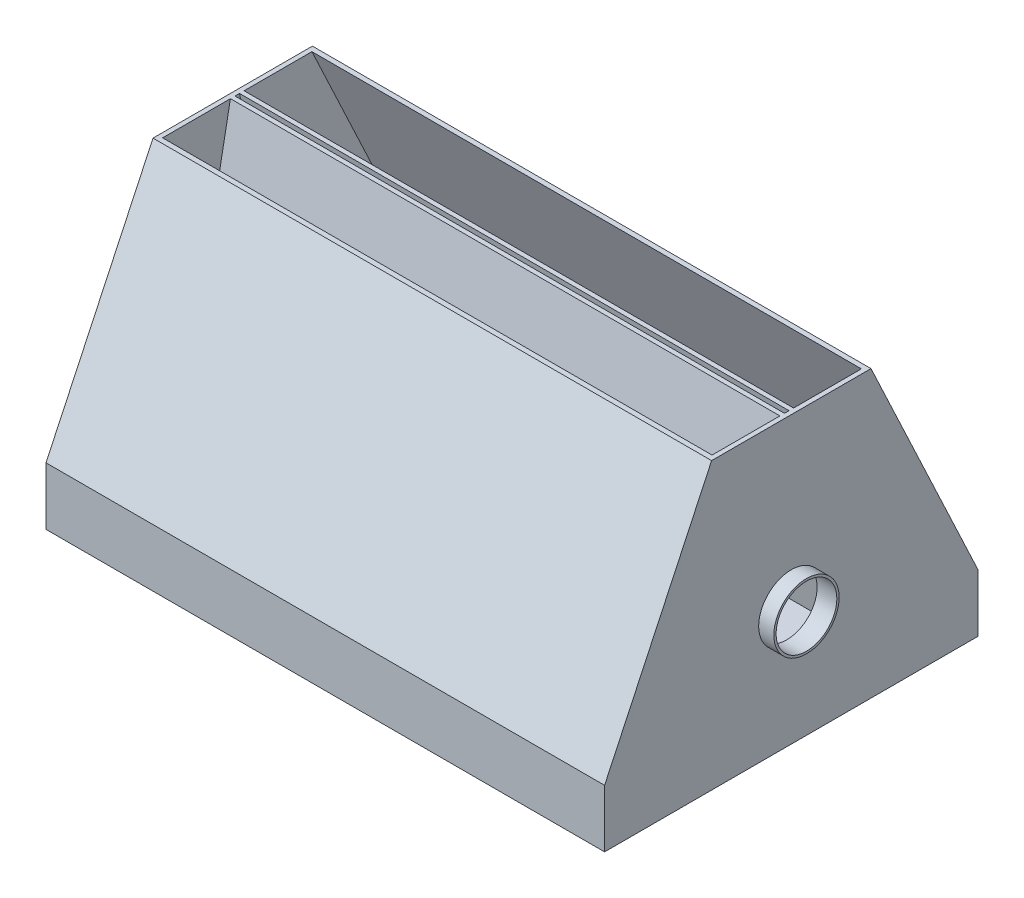
ISO-10303-21;
HEADER;
FILE_DESCRIPTION(('STEP AP214'),'2;1');
FILE_NAME('part.step','',(''),(''),'','','');
FILE_SCHEMA(('AUTOMOTIVE_DESIGN { 1 0 10303 214 1 1 1 1 }'));
ENDSEC;
DATA;
#1=APPLICATION_CONTEXT('core data for automotive mechanical design processes');
#2=APPLICATION_PROTOCOL_DEFINITION('international standard','automotive_design',2000,#1);
#3=PRODUCT_CONTEXT('',#1,'mechanical');
#4=PRODUCT('Part','Part','',(#3));
#5=PRODUCT_RELATED_PRODUCT_CATEGORY('part','',(#4));
#6=PRODUCT_DEFINITION_FORMATION('','',#4);
#7=PRODUCT_DEFINITION_CONTEXT('part definition',#1,'design');
#8=PRODUCT_DEFINITION('design','',#6,#7);
#9=PRODUCT_DEFINITION_SHAPE('','',#8);
#10=(LENGTH_UNIT() NAMED_UNIT(*) SI_UNIT(.MILLI.,.METRE.));
#11=(NAMED_UNIT(*) PLANE_ANGLE_UNIT() SI_UNIT($,.RADIAN.));
#12=(NAMED_UNIT(*) SI_UNIT($,.STERADIAN.) SOLID_ANGLE_UNIT());
#13=UNCERTAINTY_MEASURE_WITH_UNIT(LENGTH_MEASURE(1.E-05),#10,'distance_accuracy_value','');
#14=(GEOMETRIC_REPRESENTATION_CONTEXT(3) GLOBAL_UNCERTAINTY_ASSIGNED_CONTEXT((#13)) GLOBAL_UNIT_ASSIGNED_CONTEXT((#10,
#11,#12)) REPRESENTATION_CONTEXT('',''));
#15=CARTESIAN_POINT('',(0.,0.,0.));
#16=DIRECTION('',(0.,0.,1.));
#17=DIRECTION('',(1.,0.,0.));
#18=AXIS2_PLACEMENT_3D('',#15,#16,#17);
#19=CARTESIAN_POINT('',(368.,-50.,-123.));
#20=DIRECTION('',(0.,1.,0.));
#21=DIRECTION('',(0.,0.,1.));
#22=AXIS2_PLACEMENT_3D('',#19,#20,#21);
#23=PLANE('',#22);
#24=DIRECTION('',(-1.,0.,0.));
#25=VECTOR('',#24,1.);
#26=CARTESIAN_POINT('',(368.,-49.9999999999999,-119.685169687601));
#27=LINE('',#26,#25);
#28=CARTESIAN_POINT('',(365.,-50.,-119.685169687601));
#29=VERTEX_POINT('',#28);
#30=CARTESIAN_POINT('',(3.,-50.,-119.685169687601));
#31=VERTEX_POINT('',#30);
#32=EDGE_CURVE('E311',#29,#31,#27,.T.);
#33=ORIENTED_EDGE('',*,*,#32,.T.);
#34=DIRECTION('',(0.,0.,-1.));
#35=VECTOR('',#34,1.);
#36=CARTESIAN_POINT('',(3.,-50.,120.));
#37=LINE('',#36,#35);
#38=CARTESIAN_POINT('',(3.,-50.,-120.));
#39=VERTEX_POINT('',#38);
#40=EDGE_CURVE('E11',#31,#39,#37,.T.);
#41=ORIENTED_EDGE('',*,*,#40,.T.);
#42=DIRECTION('',(1.,0.,0.));
#43=VECTOR('',#42,1.);
#44=CARTESIAN_POINT('',(3.,-50.,-120.));
#45=LINE('',#44,#43);
#46=CARTESIAN_POINT('',(365.,-50.,-120.));
#47=VERTEX_POINT('',#46);
#48=EDGE_CURVE('E222',#39,#47,#45,.T.);
#49=ORIENTED_EDGE('',*,*,#48,.T.);
#50=DIRECTION('',(0.,0.,1.));
#51=VECTOR('',#50,1.);
#52=CARTESIAN_POINT('',(365.,-50.,-120.));
#53=LINE('',#52,#51);
#54=EDGE_CURVE('E202',#47,#29,#53,.T.);
#55=ORIENTED_EDGE('',*,*,#54,.T.);
#56=EDGE_LOOP('',(#33,#41,#49,#55));
#57=FACE_BOUND('',#56,.T.);
#58=ADVANCED_FACE('F40',(#57),#23,.F.);
#59=CARTESIAN_POINT('',(368.,0.,0.));
#60=DIRECTION('',(-1.,0.,0.));
#61=DIRECTION('',(0.,0.,1.));
#62=AXIS2_PLACEMENT_3D('',#59,#60,#61);
#63=PLANE('',#62);
#64=DIRECTION('',(0.,0.,1.));
#65=VECTOR('',#64,1.);
#66=CARTESIAN_POINT('',(368.,100.,52.5));
#67=LINE('',#66,#65);
#68=CARTESIAN_POINT('',(368.,100.,-52.5));
#69=VERTEX_POINT('',#68);
#70=CARTESIAN_POINT('',(368.,100.,52.5));
#71=VERTEX_POINT('',#70);
#72=EDGE_CURVE('E331',#69,#71,#67,.T.);
#73=ORIENTED_EDGE('',*,*,#72,.T.);
#74=DIRECTION('',(0.,-0.905023701749833,0.425361139822421));
#75=VECTOR('',#74,1.);
#76=CARTESIAN_POINT('',(368.,100.,52.5));
#77=LINE('',#76,#75);
#78=CARTESIAN_POINT('',(368.,-50.,123.));
#79=VERTEX_POINT('',#78);
#80=EDGE_CURVE('E326',#71,#79,#77,.T.);
#81=ORIENTED_EDGE('',*,*,#80,.T.);
#82=DIRECTION('',(0.,1.,0.));
#83=VECTOR('',#82,1.);
#84=CARTESIAN_POINT('',(368.,-87.9999999999999,123.));
#85=LINE('',#84,#83);
#86=CARTESIAN_POINT('',(368.,-87.9999999999999,123.));
#87=VERTEX_POINT('',#86);
#88=EDGE_CURVE('E238',#87,#79,#85,.T.);
#89=ORIENTED_EDGE('',*,*,#88,.F.);
#90=DIRECTION('',(0.,0.,1.));
#91=VECTOR('',#90,1.);
#92=CARTESIAN_POINT('',(368.,-87.9999999999999,-123.));
#93=LINE('',#92,#91);
#94=CARTESIAN_POINT('',(368.,-87.9999999999999,-123.));
#95=VERTEX_POINT('',#94);
#96=EDGE_CURVE('E236',#95,#87,#93,.T.);
#97=ORIENTED_EDGE('',*,*,#96,.F.);
#98=DIRECTION('',(0.,1.,0.));
#99=VECTOR('',#98,1.);
#100=CARTESIAN_POINT('',(368.,-87.9999999999999,-123.));
#101=LINE('',#100,#99);
#102=CARTESIAN_POINT('',(368.,-50.,-123.));
#103=VERTEX_POINT('',#102);
#104=EDGE_CURVE('E241',#95,#103,#101,.T.);
#105=ORIENTED_EDGE('',*,*,#104,.T.);
#106=DIRECTION('',(0.,0.905023701749833,0.425361139822421));
#107=VECTOR('',#106,1.);
#108=CARTESIAN_POINT('',(368.,100.,-52.5));
#109=LINE('',#108,#107);
#110=EDGE_CURVE('E328',#103,#69,#109,.T.);
#111=ORIENTED_EDGE('',*,*,#110,.T.);
#112=EDGE_LOOP('',(#73,#81,#89,#97,#105,#111));
#113=FACE_BOUND('',#112,.T.);
#114=CARTESIAN_POINT('',(368.,-9.99999999999993,0.));
#115=DIRECTION('',(-1.,0.,0.));
#116=DIRECTION('',(0.,0.,1.));
#117=AXIS2_PLACEMENT_3D('',#114,#115,#116);
#118=CIRCLE('',#117,21.5);
#119=CARTESIAN_POINT('',(368.,-9.99999999999993,21.5));
#120=VERTEX_POINT('',#119);
#121=EDGE_CURVE('E44',#120,#120,#118,.F.);
#122=ORIENTED_EDGE('',*,*,#121,.F.);
#123=EDGE_LOOP('',(#122));
#124=FACE_BOUND('',#123,.T.);
#125=ADVANCED_FACE('F414',(#113,#124),#63,.F.);
#126=CARTESIAN_POINT('',(365.,0.,0.));
#127=DIRECTION('',(-1.,0.,0.));
#128=DIRECTION('',(0.,0.,1.));
#129=AXIS2_PLACEMENT_3D('',#126,#127,#128);
#130=PLANE('',#129);
#131=DIRECTION('',(0.,0.,1.));
#132=VECTOR('',#131,1.);
#133=CARTESIAN_POINT('',(365.,-35.,0.));
#134=LINE('',#133,#132);
#135=CARTESIAN_POINT('',(365.,-35.,-30.));
#136=VERTEX_POINT('',#135);
#137=CARTESIAN_POINT('',(365.,-35.,30.));
#138=VERTEX_POINT('',#137);
#139=EDGE_CURVE('E284',#136,#138,#134,.T.);
#140=ORIENTED_EDGE('',*,*,#139,.F.);
#141=DIRECTION('',(0.,0.982624101660399,0.185606774758075));
#142=VECTOR('',#141,1.);
#143=CARTESIAN_POINT('',(365.,4.26570508999881,-22.5831445941113));
#144=LINE('',#143,#142);
#145=CARTESIAN_POINT('',(365.,100.,-4.49999999999998));
#146=VERTEX_POINT('',#145);
#147=EDGE_CURVE('E286',#136,#146,#144,.T.);
#148=ORIENTED_EDGE('',*,*,#147,.T.);
#149=DIRECTION('',(0.,0.,1.));
#150=VECTOR('',#149,1.);
#151=CARTESIAN_POINT('',(365.,100.,0.));
#152=LINE('',#151,#150);
#153=CARTESIAN_POINT('',(365.,100.,-49.1851696876009));
#154=VERTEX_POINT('',#153);
#155=EDGE_CURVE('E318',#154,#146,#152,.T.);
#156=ORIENTED_EDGE('',*,*,#155,.F.);
#157=DIRECTION('',(0.,0.905023701749833,0.425361139822421));
#158=VECTOR('',#157,1.);
#159=CARTESIAN_POINT('',(365.,37.027626958123,-78.7821850172831));
#160=LINE('',#159,#158);
#161=EDGE_CURVE('E300',#29,#154,#160,.T.);
#162=ORIENTED_EDGE('',*,*,#161,.F.);
#163=ORIENTED_EDGE('',*,*,#54,.F.);
#164=DIRECTION('',(0.,1.,0.));
#165=VECTOR('',#164,1.);
#166=CARTESIAN_POINT('',(365.,-87.9999999999999,-120.));
#167=LINE('',#166,#165);
#168=CARTESIAN_POINT('',(365.,-87.9999999999999,-120.));
#169=VERTEX_POINT('',#168);
#170=EDGE_CURVE('E227',#169,#47,#167,.T.);
#171=ORIENTED_EDGE('',*,*,#170,.F.);
#172=DIRECTION('',(0.,0.,1.));
#173=VECTOR('',#172,1.);
#174=CARTESIAN_POINT('',(365.,-87.9999999999999,-120.));
#175=LINE('',#174,#173);
#176=CARTESIAN_POINT('',(365.,-87.9999999999999,120.));
#177=VERTEX_POINT('',#176);
#178=EDGE_CURVE('E216',#169,#177,#175,.T.);
#179=ORIENTED_EDGE('',*,*,#178,.T.);
#180=DIRECTION('',(0.,1.,0.));
#181=VECTOR('',#180,1.);
#182=CARTESIAN_POINT('',(365.,-87.9999999999999,120.));
#183=LINE('',#182,#181);
#184=CARTESIAN_POINT('',(365.,-50.,120.));
#185=VERTEX_POINT('',#184);
#186=EDGE_CURVE('E58',#177,#185,#183,.T.);
#187=ORIENTED_EDGE('',*,*,#186,.T.);
#188=CARTESIAN_POINT('',(365.,-50.,119.685169687601));
#189=VERTEX_POINT('',#188);
#190=EDGE_CURVE('E49',#189,#185,#53,.T.);
#191=ORIENTED_EDGE('',*,*,#190,.F.);
#192=DIRECTION('',(0.,-0.905023701749833,0.425361139822421));
#193=VECTOR('',#192,1.);
#194=CARTESIAN_POINT('',(365.,37.027626958123,78.7821850172831));
#195=LINE('',#194,#193);
#196=CARTESIAN_POINT('',(365.,100.,49.1851696876009));
#197=VERTEX_POINT('',#196);
#198=EDGE_CURVE('E297',#197,#189,#195,.T.);
#199=ORIENTED_EDGE('',*,*,#198,.F.);
#200=CARTESIAN_POINT('',(365.,100.,4.50000000000002));
#201=VERTEX_POINT('',#200);
#202=EDGE_CURVE('E304',#201,#197,#152,.T.);
#203=ORIENTED_EDGE('',*,*,#202,.F.);
#204=DIRECTION('',(0.,0.982624101660398,-0.185606774758075));
#205=VECTOR('',#204,1.);
#206=CARTESIAN_POINT('',(365.,4.26570508999881,22.5831445941113));
#207=LINE('',#206,#205);
#208=EDGE_CURVE('E282',#138,#201,#207,.T.);
#209=ORIENTED_EDGE('',*,*,#208,.F.);
#210=EDGE_LOOP('',(#140,#148,#156,#162,#163,#171,#179,#187,#191,#199,#203,#209));
#211=FACE_BOUND('',#210,.T.);
#212=ADVANCED_FACE('F372',(#211),#130,.T.);
#213=CARTESIAN_POINT('',(3.,0.,0.));
#214=DIRECTION('',(-1.,0.,0.));
#215=DIRECTION('',(0.,0.,1.));
#216=AXIS2_PLACEMENT_3D('',#213,#214,#215);
#217=PLANE('',#216);
#218=DIRECTION('',(0.,0.982624101660399,0.185606774758075));
#219=VECTOR('',#218,1.);
#220=CARTESIAN_POINT('',(3.,4.26570508999881,-22.5831445941113));
#221=LINE('',#220,#219);
#222=CARTESIAN_POINT('',(3.,-35.,-30.));
#223=VERTEX_POINT('',#222);
#224=CARTESIAN_POINT('',(3.,100.,-4.49999999999998));
#225=VERTEX_POINT('',#224);
#226=EDGE_CURVE('E358',#223,#225,#221,.T.);
#227=ORIENTED_EDGE('',*,*,#226,.F.);
#228=DIRECTION('',(0.,0.,1.));
#229=VECTOR('',#228,1.);
#230=CARTESIAN_POINT('',(3.,-35.,0.));
#231=LINE('',#230,#229);
#232=CARTESIAN_POINT('',(3.,-35.,30.));
#233=VERTEX_POINT('',#232);
#234=EDGE_CURVE('E357',#223,#233,#231,.T.);
#235=ORIENTED_EDGE('',*,*,#234,.T.);
#236=DIRECTION('',(0.,0.982624101660398,-0.185606774758075));
#237=VECTOR('',#236,1.);
#238=CARTESIAN_POINT('',(3.,4.26570508999881,22.5831445941113));
#239=LINE('',#238,#237);
#240=CARTESIAN_POINT('',(3.,100.,4.50000000000002));
#241=VERTEX_POINT('',#240);
#242=EDGE_CURVE('E355',#233,#241,#239,.T.);
#243=ORIENTED_EDGE('',*,*,#242,.T.);
#244=DIRECTION('',(0.,0.,1.));
#245=VECTOR('',#244,1.);
#246=CARTESIAN_POINT('',(3.,100.,0.));
#247=LINE('',#246,#245);
#248=CARTESIAN_POINT('',(3.,100.,49.1851696876009));
#249=VERTEX_POINT('',#248);
#250=EDGE_CURVE('E306',#241,#249,#247,.T.);
#251=ORIENTED_EDGE('',*,*,#250,.T.);
#252=DIRECTION('',(0.,-0.905023701749833,0.425361139822421));
#253=VECTOR('',#252,1.);
#254=CARTESIAN_POINT('',(3.,37.027626958123,78.7821850172831));
#255=LINE('',#254,#253);
#256=CARTESIAN_POINT('',(3.,-50.,119.685169687601));
#257=VERTEX_POINT('',#256);
#258=EDGE_CURVE('E294',#249,#257,#255,.T.);
#259=ORIENTED_EDGE('',*,*,#258,.T.);
#260=CARTESIAN_POINT('',(3.,-50.,120.));
#261=VERTEX_POINT('',#260);
#262=EDGE_CURVE('E51',#261,#257,#37,.T.);
#263=ORIENTED_EDGE('',*,*,#262,.F.);
#264=DIRECTION('',(0.,1.,0.));
#265=VECTOR('',#264,1.);
#266=CARTESIAN_POINT('',(3.,-87.9999999999999,120.));
#267=LINE('',#266,#265);
#268=CARTESIAN_POINT('',(3.,-87.9999999999999,120.));
#269=VERTEX_POINT('',#268);
#270=EDGE_CURVE('E196',#269,#261,#267,.T.);
#271=ORIENTED_EDGE('',*,*,#270,.F.);
#272=DIRECTION('',(0.,0.,-1.));
#273=VECTOR('',#272,1.);
#274=CARTESIAN_POINT('',(3.,-87.9999999999999,120.));
#275=LINE('',#274,#273);
#276=CARTESIAN_POINT('',(3.,-87.9999999999999,-120.));
#277=VERTEX_POINT('',#276);
#278=EDGE_CURVE('E201',#269,#277,#275,.T.);
#279=ORIENTED_EDGE('',*,*,#278,.T.);
#280=DIRECTION('',(0.,1.,0.));
#281=VECTOR('',#280,1.);
#282=CARTESIAN_POINT('',(3.,-87.9999999999999,-120.));
#283=LINE('',#282,#281);
#284=EDGE_CURVE('E209',#277,#39,#283,.T.);
#285=ORIENTED_EDGE('',*,*,#284,.T.);
#286=ORIENTED_EDGE('',*,*,#40,.F.);
#287=DIRECTION('',(0.,0.905023701749833,0.425361139822421));
#288=VECTOR('',#287,1.);
#289=CARTESIAN_POINT('',(3.,37.027626958123,-78.7821850172831));
#290=LINE('',#289,#288);
#291=CARTESIAN_POINT('',(3.,100.,-49.1851696876009));
#292=VERTEX_POINT('',#291);
#293=EDGE_CURVE('E296',#31,#292,#290,.T.);
#294=ORIENTED_EDGE('',*,*,#293,.T.);
#295=EDGE_CURVE('E301',#292,#225,#247,.T.);
#296=ORIENTED_EDGE('',*,*,#295,.T.);
#297=EDGE_LOOP('',(#227,#235,#243,#251,#259,#263,#271,#279,#285,#286,#294,#296));
#298=FACE_BOUND('',#297,.T.);
#299=ADVANCED_FACE('F205',(#298),#217,.F.);
#300=DIRECTION('',(-1.,0.,0.));
#301=VECTOR('',#300,1.);
#302=CARTESIAN_POINT('',(365.,-50.,120.));
#303=LINE('',#302,#301);
#304=EDGE_CURVE('E220',#185,#261,#303,.T.);
#305=ORIENTED_EDGE('',*,*,#304,.T.);
#306=ORIENTED_EDGE('',*,*,#262,.T.);
#307=DIRECTION('',(-1.,0.,0.));
#308=VECTOR('',#307,1.);
#309=CARTESIAN_POINT('',(368.,-50.,119.685169687601));
#310=LINE('',#309,#308);
#311=EDGE_CURVE('E307',#189,#257,#310,.T.);
#312=ORIENTED_EDGE('',*,*,#311,.F.);
#313=ORIENTED_EDGE('',*,*,#190,.T.);
#314=EDGE_LOOP('',(#305,#306,#312,#313));
#315=FACE_BOUND('',#314,.T.);
#316=ADVANCED_FACE('F369',(#315),#23,.F.);
#317=CARTESIAN_POINT('',(368.,100.,52.5));
#318=DIRECTION('',(0.,-1.,0.));
#319=DIRECTION('',(0.,0.,-1.));
#320=AXIS2_PLACEMENT_3D('',#317,#318,#319);
#321=PLANE('',#320);
#322=DIRECTION('',(1.,0.,0.));
#323=VECTOR('',#322,1.);
#324=CARTESIAN_POINT('',(0.,100.,-1.49999999999998));
#325=LINE('',#324,#323);
#326=CARTESIAN_POINT('',(3.,100.,-1.49999999999998));
#327=VERTEX_POINT('',#326);
#328=CARTESIAN_POINT('',(365.,100.,-1.49999999999998));
#329=VERTEX_POINT('',#328);
#330=EDGE_CURVE('E264',#327,#329,#325,.T.);
#331=ORIENTED_EDGE('',*,*,#330,.T.);
#332=CARTESIAN_POINT('',(365.,100.,1.50000000000001));
#333=VERTEX_POINT('',#332);
#334=EDGE_CURVE('E321',#329,#333,#152,.T.);
#335=ORIENTED_EDGE('',*,*,#334,.T.);
#336=DIRECTION('',(1.,0.,0.));
#337=VECTOR('',#336,1.);
#338=CARTESIAN_POINT('',(0.,100.,1.50000000000002));
#339=LINE('',#338,#337);
#340=CARTESIAN_POINT('',(3.,100.,1.50000000000002));
#341=VERTEX_POINT('',#340);
#342=EDGE_CURVE('E66',#341,#333,#339,.T.);
#343=ORIENTED_EDGE('',*,*,#342,.F.);
#344=EDGE_CURVE('E325',#327,#341,#247,.T.);
#345=ORIENTED_EDGE('',*,*,#344,.F.);
#346=EDGE_LOOP('',(#331,#335,#343,#345));
#347=FACE_BOUND('',#346,.T.);
#348=DIRECTION('',(1.,0.,0.));
#349=VECTOR('',#348,1.);
#350=CARTESIAN_POINT('',(0.,100.,4.50000000000002));
#351=LINE('',#350,#349);
#352=EDGE_CURVE('E275',#241,#201,#351,.T.);
#353=ORIENTED_EDGE('',*,*,#352,.T.);
#354=ORIENTED_EDGE('',*,*,#202,.T.);
#355=DIRECTION('',(-1.,0.,0.));
#356=VECTOR('',#355,1.);
#357=CARTESIAN_POINT('',(368.,100.,49.1851696876009));
#358=LINE('',#357,#356);
#359=EDGE_CURVE('E315',#197,#249,#358,.T.);
#360=ORIENTED_EDGE('',*,*,#359,.T.);
#361=ORIENTED_EDGE('',*,*,#250,.F.);
#362=EDGE_LOOP('',(#353,#354,#360,#361));
#363=FACE_BOUND('',#362,.T.);
#364=DIRECTION('',(-1.,0.,0.));
#365=VECTOR('',#364,1.);
#366=CARTESIAN_POINT('',(368.,100.,52.5));
#367=LINE('',#366,#365);
#368=CARTESIAN_POINT('',(0.,100.,52.5));
#369=VERTEX_POINT('',#368);
#370=EDGE_CURVE('E333',#71,#369,#367,.T.);
#371=ORIENTED_EDGE('',*,*,#370,.F.);
#372=ORIENTED_EDGE('',*,*,#72,.F.);
#373=DIRECTION('',(-1.,0.,0.));
#374=VECTOR('',#373,1.);
#375=CARTESIAN_POINT('',(368.,100.,-52.5));
#376=LINE('',#375,#374);
#377=CARTESIAN_POINT('',(0.,100.,-52.5));
#378=VERTEX_POINT('',#377);
#379=EDGE_CURVE('E340',#69,#378,#376,.T.);
#380=ORIENTED_EDGE('',*,*,#379,.T.);
#381=DIRECTION('',(0.,0.,1.));
#382=VECTOR('',#381,1.);
#383=CARTESIAN_POINT('',(0.,100.,52.5));
#384=LINE('',#383,#382);
#385=EDGE_CURVE('E329',#378,#369,#384,.T.);
#386=ORIENTED_EDGE('',*,*,#385,.T.);
#387=EDGE_LOOP('',(#371,#372,#380,#386));
#388=FACE_BOUND('',#387,.T.);
#389=ORIENTED_EDGE('',*,*,#155,.T.);
#390=DIRECTION('',(1.,0.,0.));
#391=VECTOR('',#390,1.);
#392=CARTESIAN_POINT('',(0.,100.,-4.49999999999998));
#393=LINE('',#392,#391);
#394=EDGE_CURVE('E267',#225,#146,#393,.T.);
#395=ORIENTED_EDGE('',*,*,#394,.F.);
#396=ORIENTED_EDGE('',*,*,#295,.F.);
#397=DIRECTION('',(-1.,0.,0.));
#398=VECTOR('',#397,1.);
#399=CARTESIAN_POINT('',(368.,100.,-49.1851696876009));
#400=LINE('',#399,#398);
#401=EDGE_CURVE('E314',#154,#292,#400,.T.);
#402=ORIENTED_EDGE('',*,*,#401,.F.);
#403=EDGE_LOOP('',(#389,#395,#396,#402));
#404=FACE_BOUND('',#403,.T.);
#405=ADVANCED_FACE('F380',(#347,#363,#388,#404),#321,.F.);
#406=CARTESIAN_POINT('',(368.,100.,52.5));
#407=DIRECTION('',(0.,-0.425361139822421,-0.905023701749833));
#408=DIRECTION('',(0.,0.905023701749833,-0.425361139822421));
#409=AXIS2_PLACEMENT_3D('',#406,#407,#408);
#410=PLANE('',#409);
#411=DIRECTION('',(0.,-0.905023701749833,0.425361139822421));
#412=VECTOR('',#411,1.);
#413=CARTESIAN_POINT('',(0.,100.,52.5));
#414=LINE('',#413,#412);
#415=CARTESIAN_POINT('',(0.,-50.,123.));
#416=VERTEX_POINT('',#415);
#417=EDGE_CURVE('E310',#369,#416,#414,.T.);
#418=ORIENTED_EDGE('',*,*,#417,.T.);
#419=DIRECTION('',(-1.,0.,0.));
#420=VECTOR('',#419,1.);
#421=CARTESIAN_POINT('',(368.,-50.,123.));
#422=LINE('',#421,#420);
#423=EDGE_CURVE('E345',#79,#416,#422,.T.);
#424=ORIENTED_EDGE('',*,*,#423,.F.);
#425=ORIENTED_EDGE('',*,*,#80,.F.);
#426=ORIENTED_EDGE('',*,*,#370,.T.);
#427=EDGE_LOOP('',(#418,#424,#425,#426));
#428=FACE_BOUND('',#427,.T.);
#429=ADVANCED_FACE('F42',(#428),#410,.F.);
#430=CARTESIAN_POINT('',(368.,100.,-52.5));
#431=DIRECTION('',(0.,-0.425361139822421,0.905023701749833));
#432=DIRECTION('',(0.,-0.905023701749833,-0.425361139822421));
#433=AXIS2_PLACEMENT_3D('',#430,#431,#432);
#434=PLANE('',#433);
#435=DIRECTION('',(0.,0.905023701749833,0.425361139822421));
#436=VECTOR('',#435,1.);
#437=CARTESIAN_POINT('',(0.,100.,-52.5));
#438=LINE('',#437,#436);
#439=CARTESIAN_POINT('',(0.,-50.,-123.));
#440=VERTEX_POINT('',#439);
#441=EDGE_CURVE('E335',#440,#378,#438,.T.);
#442=ORIENTED_EDGE('',*,*,#441,.T.);
#443=ORIENTED_EDGE('',*,*,#379,.F.);
#444=ORIENTED_EDGE('',*,*,#110,.F.);
#445=DIRECTION('',(-1.,0.,0.));
#446=VECTOR('',#445,1.);
#447=CARTESIAN_POINT('',(368.,-50.,-123.));
#448=LINE('',#447,#446);
#449=EDGE_CURVE('E343',#103,#440,#448,.T.);
#450=ORIENTED_EDGE('',*,*,#449,.T.);
#451=EDGE_LOOP('',(#442,#443,#444,#450));
#452=FACE_BOUND('',#451,.T.);
#453=ADVANCED_FACE('F553',(#452),#434,.F.);
#454=CARTESIAN_POINT('',(0.,0.,0.));
#455=DIRECTION('',(-1.,0.,0.));
#456=DIRECTION('',(0.,0.,1.));
#457=AXIS2_PLACEMENT_3D('',#454,#455,#456);
#458=PLANE('',#457);
#459=ORIENTED_EDGE('',*,*,#417,.F.);
#460=ORIENTED_EDGE('',*,*,#385,.F.);
#461=ORIENTED_EDGE('',*,*,#441,.F.);
#462=DIRECTION('',(0.,1.,0.));
#463=VECTOR('',#462,1.);
#464=CARTESIAN_POINT('',(0.,-87.9999999999999,-123.));
#465=LINE('',#464,#463);
#466=CARTESIAN_POINT('',(0.,-87.9999999999999,-123.));
#467=VERTEX_POINT('',#466);
#468=EDGE_CURVE('E244',#467,#440,#465,.T.);
#469=ORIENTED_EDGE('',*,*,#468,.F.);
#470=DIRECTION('',(0.,0.,-1.));
#471=VECTOR('',#470,1.);
#472=CARTESIAN_POINT('',(0.,-87.9999999999999,123.));
#473=LINE('',#472,#471);
#474=CARTESIAN_POINT('',(0.,-87.9999999999999,123.));
#475=VERTEX_POINT('',#474);
#476=EDGE_CURVE('E232',#475,#467,#473,.T.);
#477=ORIENTED_EDGE('',*,*,#476,.F.);
#478=DIRECTION('',(0.,1.,0.));
#479=VECTOR('',#478,1.);
#480=CARTESIAN_POINT('',(0.,-87.9999999999999,123.));
#481=LINE('',#480,#479);
#482=EDGE_CURVE('E247',#475,#416,#481,.T.);
#483=ORIENTED_EDGE('',*,*,#482,.T.);
#484=EDGE_LOOP('',(#459,#460,#461,#469,#477,#483));
#485=FACE_BOUND('',#484,.T.);
#486=ADVANCED_FACE('F446',(#485),#458,.T.);
#487=CARTESIAN_POINT('',(368.,98.7239165805328,49.7849288947505));
#488=DIRECTION('',(0.,-0.425361139822421,-0.905023701749833));
#489=DIRECTION('',(0.,0.905023701749833,-0.425361139822421));
#490=AXIS2_PLACEMENT_3D('',#487,#488,#489);
#491=PLANE('',#490);
#492=ORIENTED_EDGE('',*,*,#258,.F.);
#493=ORIENTED_EDGE('',*,*,#359,.F.);
#494=ORIENTED_EDGE('',*,*,#198,.T.);
#495=ORIENTED_EDGE('',*,*,#311,.T.);
#496=EDGE_LOOP('',(#492,#493,#494,#495));
#497=FACE_BOUND('',#496,.T.);
#498=ADVANCED_FACE('F377',(#497),#491,.T.);
#499=CARTESIAN_POINT('',(368.,98.7239165805328,-49.7849288947505));
#500=DIRECTION('',(0.,-0.425361139822421,0.905023701749833));
#501=DIRECTION('',(0.,-0.905023701749833,-0.425361139822421));
#502=AXIS2_PLACEMENT_3D('',#499,#500,#501);
#503=PLANE('',#502);
#504=ORIENTED_EDGE('',*,*,#293,.F.);
#505=ORIENTED_EDGE('',*,*,#32,.F.);
#506=ORIENTED_EDGE('',*,*,#161,.T.);
#507=ORIENTED_EDGE('',*,*,#401,.T.);
#508=EDGE_LOOP('',(#504,#505,#506,#507));
#509=FACE_BOUND('',#508,.T.);
#510=ADVANCED_FACE('F437',(#509),#503,.T.);
#511=CARTESIAN_POINT('',(365.,-9.99999999999993,0.));
#512=DIRECTION('',(-1.,0.,0.));
#513=DIRECTION('',(0.,0.,1.));
#514=AXIS2_PLACEMENT_3D('',#511,#512,#513);
#515=CIRCLE('',#514,20.);
#516=CARTESIAN_POINT('',(365.,-9.99999999999993,20.));
#517=VERTEX_POINT('',#516);
#518=EDGE_CURVE('E256',#517,#517,#515,.F.);
#519=ORIENTED_EDGE('',*,*,#518,.T.);
#520=EDGE_LOOP('',(#519));
#521=FACE_BOUND('',#520,.T.);
#522=DIRECTION('',(0.,0.982624101660399,0.185606774758075));
#523=VECTOR('',#522,1.);
#524=CARTESIAN_POINT('',(365.,3.7185600190726,-19.6864942186196));
#525=LINE('',#524,#523);
#526=CARTESIAN_POINT('',(365.,-31.9999999999999,-26.4333333333333));
#527=VERTEX_POINT('',#526);
#528=EDGE_CURVE('E289',#527,#329,#525,.T.);
#529=ORIENTED_EDGE('',*,*,#528,.F.);
#530=DIRECTION('',(0.,0.,1.));
#531=VECTOR('',#530,1.);
#532=CARTESIAN_POINT('',(365.,-31.9999999999999,0.));
#533=LINE('',#532,#531);
#534=CARTESIAN_POINT('',(365.,-31.9999999999999,26.4333333333333));
#535=VERTEX_POINT('',#534);
#536=EDGE_CURVE('E291',#527,#535,#533,.T.);
#537=ORIENTED_EDGE('',*,*,#536,.T.);
#538=DIRECTION('',(0.,0.982624101660398,-0.185606774758075));
#539=VECTOR('',#538,1.);
#540=CARTESIAN_POINT('',(365.,3.71856001907259,19.6864942186196));
#541=LINE('',#540,#539);
#542=EDGE_CURVE('E263',#535,#333,#541,.T.);
#543=ORIENTED_EDGE('',*,*,#542,.T.);
#544=ORIENTED_EDGE('',*,*,#334,.F.);
#545=EDGE_LOOP('',(#529,#537,#543,#544));
#546=FACE_BOUND('',#545,.T.);
#547=ADVANCED_FACE('F391',(#521,#546),#130,.T.);
#548=DIRECTION('',(0.,0.,1.));
#549=VECTOR('',#548,1.);
#550=CARTESIAN_POINT('',(3.,-31.9999999999999,0.));
#551=LINE('',#550,#549);
#552=CARTESIAN_POINT('',(3.,-31.9999999999999,-26.4333333333333));
#553=VERTEX_POINT('',#552);
#554=CARTESIAN_POINT('',(3.,-31.9999999999999,26.4333333333333));
#555=VERTEX_POINT('',#554);
#556=EDGE_CURVE('E350',#553,#555,#551,.T.);
#557=ORIENTED_EDGE('',*,*,#556,.F.);
#558=DIRECTION('',(0.,0.982624101660399,0.185606774758075));
#559=VECTOR('',#558,1.);
#560=CARTESIAN_POINT('',(3.,3.7185600190726,-19.6864942186196));
#561=LINE('',#560,#559);
#562=EDGE_CURVE('E353',#553,#327,#561,.T.);
#563=ORIENTED_EDGE('',*,*,#562,.T.);
#564=ORIENTED_EDGE('',*,*,#344,.T.);
#565=DIRECTION('',(0.,0.982624101660398,-0.185606774758075));
#566=VECTOR('',#565,1.);
#567=CARTESIAN_POINT('',(3.,3.71856001907259,19.6864942186196));
#568=LINE('',#567,#566);
#569=EDGE_CURVE('E348',#555,#341,#568,.T.);
#570=ORIENTED_EDGE('',*,*,#569,.F.);
#571=EDGE_LOOP('',(#557,#563,#564,#570));
#572=FACE_BOUND('',#571,.T.);
#573=ADVANCED_FACE('F399',(#572),#217,.F.);
#574=CARTESIAN_POINT('',(0.,-31.9999999999999,0.));
#575=DIRECTION('',(0.,-1.,0.));
#576=DIRECTION('',(0.,0.,-1.));
#577=AXIS2_PLACEMENT_3D('',#574,#575,#576);
#578=PLANE('',#577);
#579=ORIENTED_EDGE('',*,*,#536,.F.);
#580=DIRECTION('',(1.,0.,0.));
#581=VECTOR('',#580,1.);
#582=CARTESIAN_POINT('',(0.,-31.9999999999999,-26.4333333333333));
#583=LINE('',#582,#581);
#584=EDGE_CURVE('E260',#553,#527,#583,.T.);
#585=ORIENTED_EDGE('',*,*,#584,.F.);
#586=ORIENTED_EDGE('',*,*,#556,.T.);
#587=DIRECTION('',(1.,0.,0.));
#588=VECTOR('',#587,1.);
#589=CARTESIAN_POINT('',(0.,-31.9999999999999,26.4333333333333));
#590=LINE('',#589,#588);
#591=EDGE_CURVE('E259',#555,#535,#590,.T.);
#592=ORIENTED_EDGE('',*,*,#591,.T.);
#593=EDGE_LOOP('',(#579,#585,#586,#592));
#594=FACE_BOUND('',#593,.T.);
#595=ADVANCED_FACE('F395',(#594),#578,.F.);
#596=CARTESIAN_POINT('',(0.,3.7185600190726,-19.6864942186196));
#597=DIRECTION('',(0.,-0.185606774758075,0.982624101660398));
#598=DIRECTION('',(0.,-0.982624101660398,-0.185606774758075));
#599=AXIS2_PLACEMENT_3D('',#596,#597,#598);
#600=PLANE('',#599);
#601=ORIENTED_EDGE('',*,*,#584,.T.);
#602=ORIENTED_EDGE('',*,*,#528,.T.);
#603=ORIENTED_EDGE('',*,*,#330,.F.);
#604=ORIENTED_EDGE('',*,*,#562,.F.);
#605=EDGE_LOOP('',(#601,#602,#603,#604));
#606=FACE_BOUND('',#605,.T.);
#607=ADVANCED_FACE('F401',(#606),#600,.T.);
#608=CARTESIAN_POINT('',(0.,4.26570508999881,-22.5831445941113));
#609=DIRECTION('',(0.,-0.185606774758075,0.982624101660398));
#610=DIRECTION('',(0.,-0.982624101660398,-0.185606774758075));
#611=AXIS2_PLACEMENT_3D('',#608,#609,#610);
#612=PLANE('',#611);
#613=ORIENTED_EDGE('',*,*,#147,.F.);
#614=DIRECTION('',(1.,0.,0.));
#615=VECTOR('',#614,1.);
#616=CARTESIAN_POINT('',(0.,-35.,-30.));
#617=LINE('',#616,#615);
#618=EDGE_CURVE('E269',#223,#136,#617,.T.);
#619=ORIENTED_EDGE('',*,*,#618,.F.);
#620=ORIENTED_EDGE('',*,*,#226,.T.);
#621=ORIENTED_EDGE('',*,*,#394,.T.);
#622=EDGE_LOOP('',(#613,#619,#620,#621));
#623=FACE_BOUND('',#622,.T.);
#624=ADVANCED_FACE('F403',(#623),#612,.F.);
#625=CARTESIAN_POINT('',(0.,-35.,0.));
#626=DIRECTION('',(0.,-1.,0.));
#627=DIRECTION('',(0.,0.,-1.));
#628=AXIS2_PLACEMENT_3D('',#625,#626,#627);
#629=PLANE('',#628);
#630=ORIENTED_EDGE('',*,*,#618,.T.);
#631=ORIENTED_EDGE('',*,*,#139,.T.);
#632=DIRECTION('',(1.,0.,0.));
#633=VECTOR('',#632,1.);
#634=CARTESIAN_POINT('',(0.,-35.,30.));
#635=LINE('',#634,#633);
#636=EDGE_CURVE('E272',#233,#138,#635,.T.);
#637=ORIENTED_EDGE('',*,*,#636,.F.);
#638=ORIENTED_EDGE('',*,*,#234,.F.);
#639=EDGE_LOOP('',(#630,#631,#637,#638));
#640=FACE_BOUND('',#639,.T.);
#641=ADVANCED_FACE('F409',(#640),#629,.T.);
#642=CARTESIAN_POINT('',(0.,4.26570508999881,22.5831445941113));
#643=DIRECTION('',(0.,0.185606774758075,0.982624101660399));
#644=DIRECTION('',(0.,-0.982624101660399,0.185606774758075));
#645=AXIS2_PLACEMENT_3D('',#642,#643,#644);
#646=PLANE('',#645);
#647=ORIENTED_EDGE('',*,*,#636,.T.);
#648=ORIENTED_EDGE('',*,*,#208,.T.);
#649=ORIENTED_EDGE('',*,*,#352,.F.);
#650=ORIENTED_EDGE('',*,*,#242,.F.);
#651=EDGE_LOOP('',(#647,#648,#649,#650));
#652=FACE_BOUND('',#651,.T.);
#653=ADVANCED_FACE('F451',(#652),#646,.T.);
#654=CARTESIAN_POINT('',(0.,3.7185600190726,19.6864942186196));
#655=DIRECTION('',(0.,0.185606774758075,0.982624101660399));
#656=DIRECTION('',(0.,-0.982624101660399,0.185606774758075));
#657=AXIS2_PLACEMENT_3D('',#654,#655,#656);
#658=PLANE('',#657);
#659=ORIENTED_EDGE('',*,*,#542,.F.);
#660=ORIENTED_EDGE('',*,*,#591,.F.);
#661=ORIENTED_EDGE('',*,*,#569,.T.);
#662=ORIENTED_EDGE('',*,*,#342,.T.);
#663=EDGE_LOOP('',(#659,#660,#661,#662));
#664=FACE_BOUND('',#663,.T.);
#665=ADVANCED_FACE('F393',(#664),#658,.F.);
#666=CARTESIAN_POINT('',(-0.000999999999973245,-9.99999999999993,0.));
#667=DIRECTION('',(1.,0.,0.));
#668=DIRECTION('',(0.,0.,-1.));
#669=AXIS2_PLACEMENT_3D('',#666,#667,#668);
#670=CYLINDRICAL_SURFACE('',#669,20.);
#671=ORIENTED_EDGE('',*,*,#518,.F.);
#672=EDGE_LOOP('',(#671));
#673=FACE_BOUND('',#672,.T.);
#674=CARTESIAN_POINT('',(378.,-9.99999999999993,0.));
#675=DIRECTION('',(1.,0.,0.));
#676=DIRECTION('',(0.,0.,-1.));
#677=AXIS2_PLACEMENT_3D('',#674,#675,#676);
#678=CIRCLE('',#677,20.);
#679=CARTESIAN_POINT('',(378.,-9.99999999999993,-20.));
#680=VERTEX_POINT('',#679);
#681=EDGE_CURVE('E250',#680,#680,#678,.T.);
#682=ORIENTED_EDGE('',*,*,#681,.T.);
#683=EDGE_LOOP('',(#682));
#684=FACE_BOUND('',#683,.T.);
#685=ADVANCED_FACE('F450',(#673,#684),#670,.F.);
#686=CARTESIAN_POINT('',(378.,-9.99999999999993,0.));
#687=DIRECTION('',(1.,0.,0.));
#688=DIRECTION('',(0.,0.,-1.));
#689=AXIS2_PLACEMENT_3D('',#686,#687,#688);
#690=PLANE('',#689);
#691=CARTESIAN_POINT('',(378.,-9.99999999999993,0.));
#692=DIRECTION('',(1.,0.,0.));
#693=DIRECTION('',(0.,0.,-1.));
#694=AXIS2_PLACEMENT_3D('',#691,#692,#693);
#695=CIRCLE('',#694,21.5);
#696=CARTESIAN_POINT('',(378.,-9.99999999999993,-21.5));
#697=VERTEX_POINT('',#696);
#698=EDGE_CURVE('E253',#697,#697,#695,.T.);
#699=ORIENTED_EDGE('',*,*,#698,.T.);
#700=EDGE_LOOP('',(#699));
#701=FACE_BOUND('',#700,.T.);
#702=ORIENTED_EDGE('',*,*,#681,.F.);
#703=EDGE_LOOP('',(#702));
#704=FACE_BOUND('',#703,.T.);
#705=ADVANCED_FACE('F491',(#701,#704),#690,.T.);
#706=CARTESIAN_POINT('',(378.,-9.99999999999993,0.));
#707=DIRECTION('',(-1.,0.,0.));
#708=DIRECTION('',(0.,0.,1.));
#709=AXIS2_PLACEMENT_3D('',#706,#707,#708);
#710=CYLINDRICAL_SURFACE('',#709,21.5);
#711=ORIENTED_EDGE('',*,*,#698,.F.);
#712=EDGE_LOOP('',(#711));
#713=FACE_BOUND('',#712,.T.);
#714=ORIENTED_EDGE('',*,*,#121,.T.);
#715=EDGE_LOOP('',(#714));
#716=FACE_BOUND('',#715,.T.);
#717=ADVANCED_FACE('F483',(#713,#716),#710,.T.);
#718=CARTESIAN_POINT('',(0.,-87.9999999999999,0.));
#719=DIRECTION('',(0.,-1.,0.));
#720=DIRECTION('',(0.,0.,-1.));
#721=AXIS2_PLACEMENT_3D('',#718,#719,#720);
#722=PLANE('',#721);
#723=DIRECTION('',(-1.,0.,0.));
#724=VECTOR('',#723,1.);
#725=CARTESIAN_POINT('',(368.,-87.9999999999999,123.));
#726=LINE('',#725,#724);
#727=EDGE_CURVE('E208',#87,#475,#726,.T.);
#728=ORIENTED_EDGE('',*,*,#727,.T.);
#729=ORIENTED_EDGE('',*,*,#476,.T.);
#730=DIRECTION('',(1.,0.,0.));
#731=VECTOR('',#730,1.);
#732=CARTESIAN_POINT('',(0.,-87.9999999999999,-123.));
#733=LINE('',#732,#731);
#734=EDGE_CURVE('E234',#467,#95,#733,.T.);
#735=ORIENTED_EDGE('',*,*,#734,.T.);
#736=ORIENTED_EDGE('',*,*,#96,.T.);
#737=EDGE_LOOP('',(#728,#729,#735,#736));
#738=FACE_BOUND('',#737,.T.);
#739=ORIENTED_EDGE('',*,*,#278,.F.);
#740=DIRECTION('',(-1.,0.,0.));
#741=VECTOR('',#740,1.);
#742=CARTESIAN_POINT('',(365.,-87.9999999999999,120.));
#743=LINE('',#742,#741);
#744=EDGE_CURVE('E193',#177,#269,#743,.T.);
#745=ORIENTED_EDGE('',*,*,#744,.F.);
#746=ORIENTED_EDGE('',*,*,#178,.F.);
#747=DIRECTION('',(1.,0.,0.));
#748=VECTOR('',#747,1.);
#749=CARTESIAN_POINT('',(3.,-87.9999999999999,-120.));
#750=LINE('',#749,#748);
#751=EDGE_CURVE('E214',#277,#169,#750,.T.);
#752=ORIENTED_EDGE('',*,*,#751,.F.);
#753=EDGE_LOOP('',(#739,#745,#746,#752));
#754=FACE_BOUND('',#753,.T.);
#755=ADVANCED_FACE('F212',(#738,#754),#722,.T.);
#756=CARTESIAN_POINT('',(368.,-87.9999999999999,123.));
#757=DIRECTION('',(0.,0.,-1.));
#758=DIRECTION('',(-1.,0.,0.));
#759=AXIS2_PLACEMENT_3D('',#756,#757,#758);
#760=PLANE('',#759);
#761=ORIENTED_EDGE('',*,*,#423,.T.);
#762=ORIENTED_EDGE('',*,*,#482,.F.);
#763=ORIENTED_EDGE('',*,*,#727,.F.);
#764=ORIENTED_EDGE('',*,*,#88,.T.);
#765=EDGE_LOOP('',(#761,#762,#763,#764));
#766=FACE_BOUND('',#765,.T.);
#767=ADVANCED_FACE('F482',(#766),#760,.F.);
#768=CARTESIAN_POINT('',(0.,-87.9999999999999,-123.));
#769=DIRECTION('',(0.,0.,1.));
#770=DIRECTION('',(1.,0.,0.));
#771=AXIS2_PLACEMENT_3D('',#768,#769,#770);
#772=PLANE('',#771);
#773=ORIENTED_EDGE('',*,*,#449,.F.);
#774=ORIENTED_EDGE('',*,*,#104,.F.);
#775=ORIENTED_EDGE('',*,*,#734,.F.);
#776=ORIENTED_EDGE('',*,*,#468,.T.);
#777=EDGE_LOOP('',(#773,#774,#775,#776));
#778=FACE_BOUND('',#777,.T.);
#779=ADVANCED_FACE('F477',(#778),#772,.F.);
#780=CARTESIAN_POINT('',(365.,-87.9999999999999,120.));
#781=DIRECTION('',(0.,0.,-1.));
#782=DIRECTION('',(-1.,0.,0.));
#783=AXIS2_PLACEMENT_3D('',#780,#781,#782);
#784=PLANE('',#783);
#785=ORIENTED_EDGE('',*,*,#304,.F.);
#786=ORIENTED_EDGE('',*,*,#186,.F.);
#787=ORIENTED_EDGE('',*,*,#744,.T.);
#788=ORIENTED_EDGE('',*,*,#270,.T.);
#789=EDGE_LOOP('',(#785,#786,#787,#788));
#790=FACE_BOUND('',#789,.T.);
#791=ADVANCED_FACE('F195',(#790),#784,.T.);
#792=CARTESIAN_POINT('',(3.,-87.9999999999999,-120.));
#793=DIRECTION('',(0.,0.,1.));
#794=DIRECTION('',(1.,0.,0.));
#795=AXIS2_PLACEMENT_3D('',#792,#793,#794);
#796=PLANE('',#795);
#797=ORIENTED_EDGE('',*,*,#48,.F.);
#798=ORIENTED_EDGE('',*,*,#284,.F.);
#799=ORIENTED_EDGE('',*,*,#751,.T.);
#800=ORIENTED_EDGE('',*,*,#170,.T.);
#801=EDGE_LOOP('',(#797,#798,#799,#800));
#802=FACE_BOUND('',#801,.T.);
#803=ADVANCED_FACE('F471',(#802),#796,.T.);
#804=CLOSED_SHELL('',(#58,#125,#212,#299,#316,#405,#429,#453,#486,#498,#510,#547,#573,#595,#607,
#624,#641,#653,#665,#685,#705,#717,#755,#767,#779,#791,#803));
#805=MANIFOLD_SOLID_BREP('B2',#804);
#806=ADVANCED_BREP_SHAPE_REPRESENTATION('',(#18,#805),#14);
#807=SHAPE_DEFINITION_REPRESENTATION(#9,#806);
ENDSEC;
END-ISO-10303-21;
